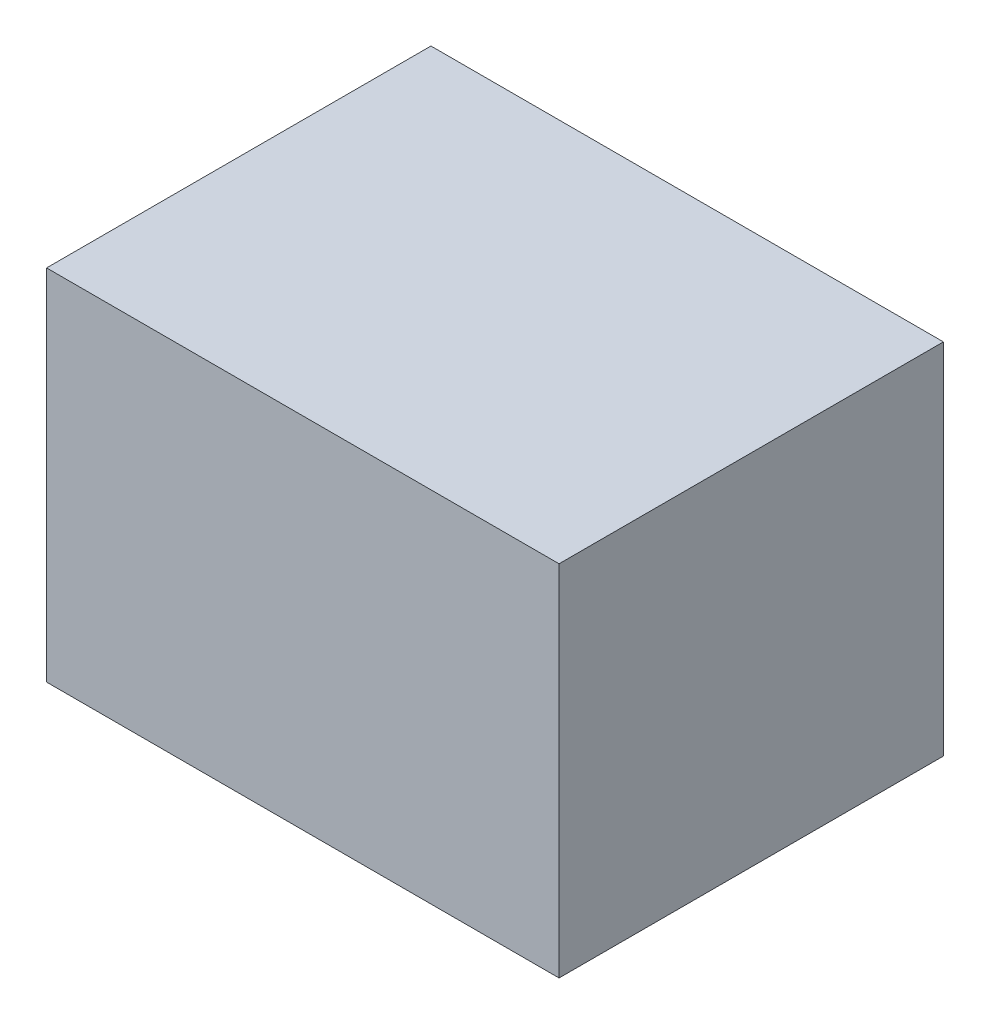
ISO-10303-21;
HEADER;
FILE_DESCRIPTION(('STEP AP214'),'2;1');
FILE_NAME('part.step','',(''),(''),'','','');
FILE_SCHEMA(('AUTOMOTIVE_DESIGN { 1 0 10303 214 1 1 1 1 }'));
ENDSEC;
DATA;
#1=APPLICATION_CONTEXT('core data for automotive mechanical design processes');
#2=APPLICATION_PROTOCOL_DEFINITION('international standard','automotive_design',2000,#1);
#3=PRODUCT_CONTEXT('',#1,'mechanical');
#4=PRODUCT('Part','Part','',(#3));
#5=PRODUCT_RELATED_PRODUCT_CATEGORY('part','',(#4));
#6=PRODUCT_DEFINITION_FORMATION('','',#4);
#7=PRODUCT_DEFINITION_CONTEXT('part definition',#1,'design');
#8=PRODUCT_DEFINITION('design','',#6,#7);
#9=PRODUCT_DEFINITION_SHAPE('','',#8);
#10=(LENGTH_UNIT() NAMED_UNIT(*) SI_UNIT(.MILLI.,.METRE.));
#11=(NAMED_UNIT(*) PLANE_ANGLE_UNIT() SI_UNIT($,.RADIAN.));
#12=(NAMED_UNIT(*) SI_UNIT($,.STERADIAN.) SOLID_ANGLE_UNIT());
#13=UNCERTAINTY_MEASURE_WITH_UNIT(LENGTH_MEASURE(1.E-05),#10,'distance_accuracy_value','');
#14=(GEOMETRIC_REPRESENTATION_CONTEXT(3) GLOBAL_UNCERTAINTY_ASSIGNED_CONTEXT((#13)) GLOBAL_UNIT_ASSIGNED_CONTEXT((#10,
#11,#12)) REPRESENTATION_CONTEXT('',''));
#15=CARTESIAN_POINT('',(0.,0.,0.));
#16=DIRECTION('',(0.,0.,1.));
#17=DIRECTION('',(1.,0.,0.));
#18=AXIS2_PLACEMENT_3D('',#15,#16,#17);
#19=CARTESIAN_POINT('',(10.,-7.,-15.));
#20=DIRECTION('',(1.,0.,0.));
#21=DIRECTION('',(0.,0.,-1.));
#22=AXIS2_PLACEMENT_3D('',#19,#20,#21);
#23=PLANE('',#22);
#24=DIRECTION('',(0.,1.,0.));
#25=VECTOR('',#24,1.);
#26=CARTESIAN_POINT('',(10.,-7.,0.));
#27=LINE('',#26,#25);
#28=CARTESIAN_POINT('',(10.,-7.,0.));
#29=VERTEX_POINT('',#28);
#30=CARTESIAN_POINT('',(10.,7.,0.));
#31=VERTEX_POINT('',#30);
#32=EDGE_CURVE('E104',#29,#31,#27,.T.);
#33=ORIENTED_EDGE('',*,*,#32,.F.);
#34=DIRECTION('',(0.,0.,1.));
#35=VECTOR('',#34,1.);
#36=CARTESIAN_POINT('',(10.,-7.,-15.));
#37=LINE('',#36,#35);
#38=CARTESIAN_POINT('',(10.,-7.,-15.));
#39=VERTEX_POINT('',#38);
#40=EDGE_CURVE('E11',#39,#29,#37,.T.);
#41=ORIENTED_EDGE('',*,*,#40,.F.);
#42=DIRECTION('',(0.,1.,0.));
#43=VECTOR('',#42,1.);
#44=CARTESIAN_POINT('',(10.,-7.,-15.));
#45=LINE('',#44,#43);
#46=CARTESIAN_POINT('',(10.,7.,-15.));
#47=VERTEX_POINT('',#46);
#48=EDGE_CURVE('E100',#39,#47,#45,.T.);
#49=ORIENTED_EDGE('',*,*,#48,.T.);
#50=DIRECTION('',(0.,0.,1.));
#51=VECTOR('',#50,1.);
#52=CARTESIAN_POINT('',(10.,7.,-15.));
#53=LINE('',#52,#51);
#54=EDGE_CURVE('E45',#47,#31,#53,.T.);
#55=ORIENTED_EDGE('',*,*,#54,.T.);
#56=EDGE_LOOP('',(#33,#41,#49,#55));
#57=FACE_BOUND('',#56,.T.);
#58=ADVANCED_FACE('F39',(#57),#23,.T.);
#59=CARTESIAN_POINT('',(-10.,-7.,-15.));
#60=DIRECTION('',(0.,-1.,0.));
#61=DIRECTION('',(0.,0.,-1.));
#62=AXIS2_PLACEMENT_3D('',#59,#60,#61);
#63=PLANE('',#62);
#64=DIRECTION('',(1.,0.,0.));
#65=VECTOR('',#64,1.);
#66=CARTESIAN_POINT('',(-10.,-7.,0.));
#67=LINE('',#66,#65);
#68=CARTESIAN_POINT('',(-10.,-7.,0.));
#69=VERTEX_POINT('',#68);
#70=EDGE_CURVE('E98',#69,#29,#67,.T.);
#71=ORIENTED_EDGE('',*,*,#70,.F.);
#72=DIRECTION('',(0.,0.,1.));
#73=VECTOR('',#72,1.);
#74=CARTESIAN_POINT('',(-10.,-7.,-15.));
#75=LINE('',#74,#73);
#76=CARTESIAN_POINT('',(-10.,-7.,-15.));
#77=VERTEX_POINT('',#76);
#78=EDGE_CURVE('E48',#77,#69,#75,.T.);
#79=ORIENTED_EDGE('',*,*,#78,.F.);
#80=DIRECTION('',(1.,0.,0.));
#81=VECTOR('',#80,1.);
#82=CARTESIAN_POINT('',(-10.,-7.,-15.));
#83=LINE('',#82,#81);
#84=EDGE_CURVE('E92',#77,#39,#83,.T.);
#85=ORIENTED_EDGE('',*,*,#84,.T.);
#86=ORIENTED_EDGE('',*,*,#40,.T.);
#87=EDGE_LOOP('',(#71,#79,#85,#86));
#88=FACE_BOUND('',#87,.T.);
#89=ADVANCED_FACE('F111',(#88),#63,.T.);
#90=CARTESIAN_POINT('',(-10.,-7.,-15.));
#91=DIRECTION('',(-1.,0.,0.));
#92=DIRECTION('',(0.,0.,1.));
#93=AXIS2_PLACEMENT_3D('',#90,#91,#92);
#94=PLANE('',#93);
#95=DIRECTION('',(0.,-1.,0.));
#96=VECTOR('',#95,1.);
#97=CARTESIAN_POINT('',(-10.,-7.,0.));
#98=LINE('',#97,#96);
#99=CARTESIAN_POINT('',(-10.,7.,0.));
#100=VERTEX_POINT('',#99);
#101=EDGE_CURVE('E87',#100,#69,#98,.T.);
#102=ORIENTED_EDGE('',*,*,#101,.F.);
#103=DIRECTION('',(0.,0.,1.));
#104=VECTOR('',#103,1.);
#105=CARTESIAN_POINT('',(-10.,7.,-15.));
#106=LINE('',#105,#104);
#107=CARTESIAN_POINT('',(-10.,7.,-15.));
#108=VERTEX_POINT('',#107);
#109=EDGE_CURVE('E84',#108,#100,#106,.T.);
#110=ORIENTED_EDGE('',*,*,#109,.F.);
#111=DIRECTION('',(0.,-1.,0.));
#112=VECTOR('',#111,1.);
#113=CARTESIAN_POINT('',(-10.,-7.,-15.));
#114=LINE('',#113,#112);
#115=EDGE_CURVE('E90',#108,#77,#114,.T.);
#116=ORIENTED_EDGE('',*,*,#115,.T.);
#117=ORIENTED_EDGE('',*,*,#78,.T.);
#118=EDGE_LOOP('',(#102,#110,#116,#117));
#119=FACE_BOUND('',#118,.T.);
#120=ADVANCED_FACE('F86',(#119),#94,.T.);
#121=CARTESIAN_POINT('',(-10.,7.,-15.));
#122=DIRECTION('',(0.,1.,0.));
#123=DIRECTION('',(0.,0.,1.));
#124=AXIS2_PLACEMENT_3D('',#121,#122,#123);
#125=PLANE('',#124);
#126=DIRECTION('',(-1.,0.,0.));
#127=VECTOR('',#126,1.);
#128=CARTESIAN_POINT('',(-10.,7.,0.));
#129=LINE('',#128,#127);
#130=EDGE_CURVE('E107',#31,#100,#129,.T.);
#131=ORIENTED_EDGE('',*,*,#130,.F.);
#132=ORIENTED_EDGE('',*,*,#54,.F.);
#133=DIRECTION('',(-1.,0.,0.));
#134=VECTOR('',#133,1.);
#135=CARTESIAN_POINT('',(-10.,7.,-15.));
#136=LINE('',#135,#134);
#137=EDGE_CURVE('E93',#47,#108,#136,.T.);
#138=ORIENTED_EDGE('',*,*,#137,.T.);
#139=ORIENTED_EDGE('',*,*,#109,.T.);
#140=EDGE_LOOP('',(#131,#132,#138,#139));
#141=FACE_BOUND('',#140,.T.);
#142=ADVANCED_FACE('F96',(#141),#125,.T.);
#143=CARTESIAN_POINT('',(0.,0.,-15.));
#144=DIRECTION('',(0.,0.,-1.));
#145=DIRECTION('',(-1.,0.,0.));
#146=AXIS2_PLACEMENT_3D('',#143,#144,#145);
#147=PLANE('',#146);
#148=ORIENTED_EDGE('',*,*,#48,.F.);
#149=ORIENTED_EDGE('',*,*,#84,.F.);
#150=ORIENTED_EDGE('',*,*,#115,.F.);
#151=ORIENTED_EDGE('',*,*,#137,.F.);
#152=EDGE_LOOP('',(#148,#149,#150,#151));
#153=FACE_BOUND('',#152,.T.);
#154=ADVANCED_FACE('F95',(#153),#147,.T.);
#155=CARTESIAN_POINT('',(0.,0.,0.));
#156=DIRECTION('',(0.,0.,-1.));
#157=DIRECTION('',(-1.,0.,0.));
#158=AXIS2_PLACEMENT_3D('',#155,#156,#157);
#159=PLANE('',#158);
#160=ORIENTED_EDGE('',*,*,#32,.T.);
#161=ORIENTED_EDGE('',*,*,#130,.T.);
#162=ORIENTED_EDGE('',*,*,#101,.T.);
#163=ORIENTED_EDGE('',*,*,#70,.T.);
#164=EDGE_LOOP('',(#160,#161,#162,#163));
#165=FACE_BOUND('',#164,.T.);
#166=ADVANCED_FACE('F115',(#165),#159,.F.);
#167=CLOSED_SHELL('',(#58,#89,#120,#142,#154,#166));
#168=MANIFOLD_SOLID_BREP('B2',#167);
#169=ADVANCED_BREP_SHAPE_REPRESENTATION('',(#18,#168),#14);
#170=SHAPE_DEFINITION_REPRESENTATION(#9,#169);
ENDSEC;
END-ISO-10303-21;
